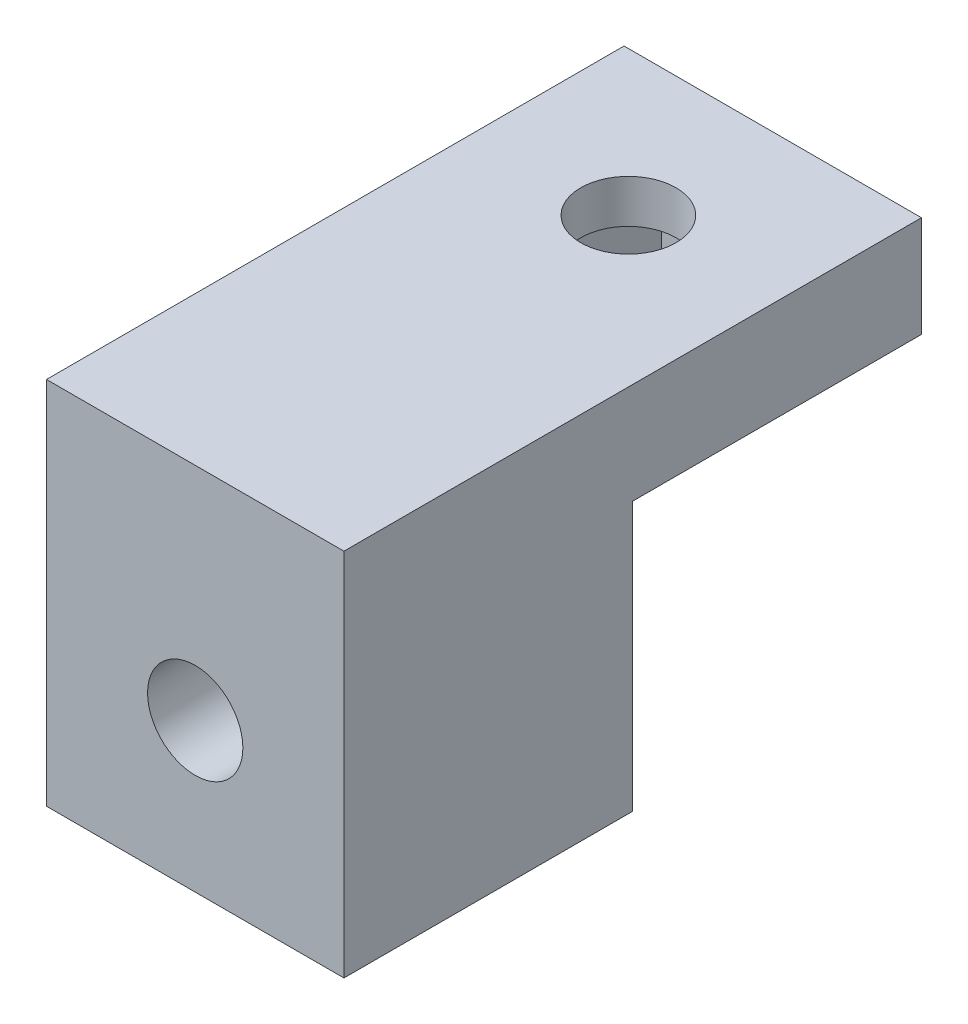
ISO-10303-21;
HEADER;
FILE_DESCRIPTION(('STEP AP214'),'2;1');
FILE_NAME('part.step','',(''),(''),'','','');
FILE_SCHEMA(('AUTOMOTIVE_DESIGN { 1 0 10303 214 1 1 1 1 }'));
ENDSEC;
DATA;
#1=APPLICATION_CONTEXT('core data for automotive mechanical design processes');
#2=APPLICATION_PROTOCOL_DEFINITION('international standard','automotive_design',2000,#1);
#3=PRODUCT_CONTEXT('',#1,'mechanical');
#4=PRODUCT('Part','Part','',(#3));
#5=PRODUCT_RELATED_PRODUCT_CATEGORY('part','',(#4));
#6=PRODUCT_DEFINITION_FORMATION('','',#4);
#7=PRODUCT_DEFINITION_CONTEXT('part definition',#1,'design');
#8=PRODUCT_DEFINITION('design','',#6,#7);
#9=PRODUCT_DEFINITION_SHAPE('','',#8);
#10=(LENGTH_UNIT() NAMED_UNIT(*) SI_UNIT(.MILLI.,.METRE.));
#11=(NAMED_UNIT(*) PLANE_ANGLE_UNIT() SI_UNIT($,.RADIAN.));
#12=(NAMED_UNIT(*) SI_UNIT($,.STERADIAN.) SOLID_ANGLE_UNIT());
#13=UNCERTAINTY_MEASURE_WITH_UNIT(LENGTH_MEASURE(1.E-05),#10,'distance_accuracy_value','');
#14=(GEOMETRIC_REPRESENTATION_CONTEXT(3) GLOBAL_UNCERTAINTY_ASSIGNED_CONTEXT((#13)) GLOBAL_UNIT_ASSIGNED_CONTEXT((#10,
#11,#12)) REPRESENTATION_CONTEXT('',''));
#15=CARTESIAN_POINT('',(0.,0.,0.));
#16=DIRECTION('',(0.,0.,1.));
#17=DIRECTION('',(1.,0.,0.));
#18=AXIS2_PLACEMENT_3D('',#15,#16,#17);
#19=CARTESIAN_POINT('',(0.,0.,-5.));
#20=DIRECTION('',(0.,0.,1.));
#21=DIRECTION('',(1.,0.,0.));
#22=AXIS2_PLACEMENT_3D('',#19,#20,#21);
#23=PLANE('',#22);
#24=DIRECTION('',(-1.,0.,0.));
#25=VECTOR('',#24,1.);
#26=CARTESIAN_POINT('',(1.65,-2.8,-5.));
#27=LINE('',#26,#25);
#28=CARTESIAN_POINT('',(1.65,-2.8,-5.));
#29=VERTEX_POINT('',#28);
#30=CARTESIAN_POINT('',(-1.65,-2.8,-5.));
#31=VERTEX_POINT('',#30);
#32=EDGE_CURVE('E275',#29,#31,#27,.T.);
#33=ORIENTED_EDGE('',*,*,#32,.F.);
#34=DIRECTION('',(-0.529219672623424,-0.848484848484849,0.));
#35=VECTOR('',#34,1.);
#36=CARTESIAN_POINT('',(3.3964249196573,0.,-5.));
#37=LINE('',#36,#35);
#38=CARTESIAN_POINT('',(3.3964249196573,0.,-5.));
#39=VERTEX_POINT('',#38);
#40=EDGE_CURVE('E255',#39,#29,#37,.T.);
#41=ORIENTED_EDGE('',*,*,#40,.F.);
#42=DIRECTION('',(0.529219672623423,-0.848484848484849,0.));
#43=VECTOR('',#42,1.);
#44=CARTESIAN_POINT('',(1.65,2.80000000000001,-5.));
#45=LINE('',#44,#43);
#46=CARTESIAN_POINT('',(1.65,2.80000000000001,-5.));
#47=VERTEX_POINT('',#46);
#48=EDGE_CURVE('E260',#47,#39,#45,.T.);
#49=ORIENTED_EDGE('',*,*,#48,.F.);
#50=DIRECTION('',(-1.,0.,0.));
#51=VECTOR('',#50,1.);
#52=CARTESIAN_POINT('',(1.65,2.80000000000001,-5.));
#53=LINE('',#52,#51);
#54=CARTESIAN_POINT('',(-1.65,2.80000000000001,-5.));
#55=VERTEX_POINT('',#54);
#56=EDGE_CURVE('E284',#47,#55,#53,.T.);
#57=ORIENTED_EDGE('',*,*,#56,.T.);
#58=DIRECTION('',(0.529219672623426,0.848484848484847,0.));
#59=VECTOR('',#58,1.);
#60=CARTESIAN_POINT('',(-3.39642491965731,0.,-5.));
#61=LINE('',#60,#59);
#62=CARTESIAN_POINT('',(-3.39642491965731,0.,-5.));
#63=VERTEX_POINT('',#62);
#64=EDGE_CURVE('E281',#63,#55,#61,.T.);
#65=ORIENTED_EDGE('',*,*,#64,.F.);
#66=DIRECTION('',(0.529219672623427,-0.848484848484847,0.));
#67=VECTOR('',#66,1.);
#68=CARTESIAN_POINT('',(-3.39642491965731,0.,-5.));
#69=LINE('',#68,#67);
#70=EDGE_CURVE('E278',#63,#31,#69,.T.);
#71=ORIENTED_EDGE('',*,*,#70,.T.);
#72=EDGE_LOOP('',(#33,#41,#49,#57,#65,#71));
#73=FACE_BOUND('',#72,.T.);
#74=DIRECTION('',(-1.,0.,0.));
#75=VECTOR('',#74,1.);
#76=CARTESIAN_POINT('',(5.15,4.15,-5.));
#77=LINE('',#76,#75);
#78=CARTESIAN_POINT('',(5.15,4.15,-5.));
#79=VERTEX_POINT('',#78);
#80=CARTESIAN_POINT('',(-5.15,4.15,-5.));
#81=VERTEX_POINT('',#80);
#82=EDGE_CURVE('E78',#79,#81,#77,.T.);
#83=ORIENTED_EDGE('',*,*,#82,.F.);
#84=DIRECTION('',(0.,1.,0.));
#85=VECTOR('',#84,1.);
#86=CARTESIAN_POINT('',(5.15,7.65,-5.));
#87=LINE('',#86,#85);
#88=CARTESIAN_POINT('',(5.15,-5.15,-5.));
#89=VERTEX_POINT('',#88);
#90=EDGE_CURVE('E304',#89,#79,#87,.T.);
#91=ORIENTED_EDGE('',*,*,#90,.F.);
#92=DIRECTION('',(1.,0.,0.));
#93=VECTOR('',#92,1.);
#94=CARTESIAN_POINT('',(-5.15,-5.15,-5.));
#95=LINE('',#94,#93);
#96=CARTESIAN_POINT('',(-5.15,-5.15,-5.));
#97=VERTEX_POINT('',#96);
#98=EDGE_CURVE('E309',#97,#89,#95,.T.);
#99=ORIENTED_EDGE('',*,*,#98,.F.);
#100=DIRECTION('',(0.,-1.,0.));
#101=VECTOR('',#100,1.);
#102=CARTESIAN_POINT('',(-5.15,7.65,-5.));
#103=LINE('',#102,#101);
#104=EDGE_CURVE('E317',#81,#97,#103,.T.);
#105=ORIENTED_EDGE('',*,*,#104,.F.);
#106=EDGE_LOOP('',(#83,#91,#99,#105));
#107=FACE_BOUND('',#106,.T.);
#108=ADVANCED_FACE('F55',(#73,#107),#23,.F.);
#109=CARTESIAN_POINT('',(0.,0.,5.));
#110=DIRECTION('',(0.,0.,1.));
#111=DIRECTION('',(1.,0.,0.));
#112=AXIS2_PLACEMENT_3D('',#109,#110,#111);
#113=PLANE('',#112);
#114=DIRECTION('',(0.,1.,0.));
#115=VECTOR('',#114,1.);
#116=CARTESIAN_POINT('',(5.15,7.65,5.));
#117=LINE('',#116,#115);
#118=CARTESIAN_POINT('',(5.15,-5.15,5.));
#119=VERTEX_POINT('',#118);
#120=CARTESIAN_POINT('',(5.15,7.65,5.));
#121=VERTEX_POINT('',#120);
#122=EDGE_CURVE('E305',#119,#121,#117,.T.);
#123=ORIENTED_EDGE('',*,*,#122,.T.);
#124=DIRECTION('',(-1.,0.,0.));
#125=VECTOR('',#124,1.);
#126=CARTESIAN_POINT('',(-5.15,7.65,5.));
#127=LINE('',#126,#125);
#128=CARTESIAN_POINT('',(-5.15,7.65,5.));
#129=VERTEX_POINT('',#128);
#130=EDGE_CURVE('E308',#121,#129,#127,.T.);
#131=ORIENTED_EDGE('',*,*,#130,.T.);
#132=DIRECTION('',(0.,-1.,0.));
#133=VECTOR('',#132,1.);
#134=CARTESIAN_POINT('',(-5.15,7.65,5.));
#135=LINE('',#134,#133);
#136=CARTESIAN_POINT('',(-5.15,-5.15,5.));
#137=VERTEX_POINT('',#136);
#138=EDGE_CURVE('E311',#129,#137,#135,.T.);
#139=ORIENTED_EDGE('',*,*,#138,.T.);
#140=DIRECTION('',(1.,0.,0.));
#141=VECTOR('',#140,1.);
#142=CARTESIAN_POINT('',(-5.15,-5.15,5.));
#143=LINE('',#142,#141);
#144=EDGE_CURVE('E313',#137,#119,#143,.T.);
#145=ORIENTED_EDGE('',*,*,#144,.T.);
#146=EDGE_LOOP('',(#123,#131,#139,#145));
#147=FACE_BOUND('',#146,.T.);
#148=CARTESIAN_POINT('',(0.,0.,5.));
#149=DIRECTION('',(0.,0.,1.));
#150=DIRECTION('',(1.,0.,0.));
#151=AXIS2_PLACEMENT_3D('',#148,#149,#150);
#152=CIRCLE('',#151,1.65);
#153=CARTESIAN_POINT('',(1.65,0.,5.));
#154=VERTEX_POINT('',#153);
#155=EDGE_CURVE('E291',#154,#154,#152,.T.);
#156=ORIENTED_EDGE('',*,*,#155,.F.);
#157=EDGE_LOOP('',(#156));
#158=FACE_BOUND('',#157,.T.);
#159=ADVANCED_FACE('F350',(#147,#158),#113,.T.);
#160=CARTESIAN_POINT('',(5.15,7.65,5.));
#161=DIRECTION('',(-1.,0.,0.));
#162=DIRECTION('',(0.,-1.,0.));
#163=AXIS2_PLACEMENT_3D('',#160,#161,#162);
#164=PLANE('',#163);
#165=ORIENTED_EDGE('',*,*,#90,.T.);
#166=DIRECTION('',(0.,0.,1.));
#167=VECTOR('',#166,1.);
#168=CARTESIAN_POINT('',(5.15,4.15,-15.));
#169=LINE('',#168,#167);
#170=CARTESIAN_POINT('',(5.15,4.15,-15.));
#171=VERTEX_POINT('',#170);
#172=EDGE_CURVE('E249',#171,#79,#169,.T.);
#173=ORIENTED_EDGE('',*,*,#172,.F.);
#174=DIRECTION('',(0.,-1.,0.));
#175=VECTOR('',#174,1.);
#176=CARTESIAN_POINT('',(5.15,7.65,-15.));
#177=LINE('',#176,#175);
#178=CARTESIAN_POINT('',(5.15,7.65,-15.));
#179=VERTEX_POINT('',#178);
#180=EDGE_CURVE('E238',#179,#171,#177,.T.);
#181=ORIENTED_EDGE('',*,*,#180,.F.);
#182=DIRECTION('',(0.,0.,-1.));
#183=VECTOR('',#182,1.);
#184=CARTESIAN_POINT('',(5.15,7.65,5.));
#185=LINE('',#184,#183);
#186=EDGE_CURVE('E12',#121,#179,#185,.T.);
#187=ORIENTED_EDGE('',*,*,#186,.F.);
#188=ORIENTED_EDGE('',*,*,#122,.F.);
#189=DIRECTION('',(0.,0.,-1.));
#190=VECTOR('',#189,1.);
#191=CARTESIAN_POINT('',(5.15,-5.15,5.));
#192=LINE('',#191,#190);
#193=EDGE_CURVE('E315',#119,#89,#192,.T.);
#194=ORIENTED_EDGE('',*,*,#193,.T.);
#195=EDGE_LOOP('',(#165,#173,#181,#187,#188,#194));
#196=FACE_BOUND('',#195,.T.);
#197=ADVANCED_FACE('F57',(#196),#164,.F.);
#198=CARTESIAN_POINT('',(-5.15,7.65,5.));
#199=DIRECTION('',(0.,-1.,0.));
#200=DIRECTION('',(0.,0.,-1.));
#201=AXIS2_PLACEMENT_3D('',#198,#199,#200);
#202=PLANE('',#201);
#203=CARTESIAN_POINT('',(0.,7.65,-10.));
#204=DIRECTION('',(0.,-1.,0.));
#205=DIRECTION('',(0.,0.,-1.));
#206=AXIS2_PLACEMENT_3D('',#203,#204,#205);
#207=CIRCLE('',#206,1.65);
#208=CARTESIAN_POINT('',(0.,7.65,-11.65));
#209=VERTEX_POINT('',#208);
#210=EDGE_CURVE('E206',#209,#209,#207,.F.);
#211=ORIENTED_EDGE('',*,*,#210,.F.);
#212=EDGE_LOOP('',(#211));
#213=FACE_BOUND('',#212,.T.);
#214=ORIENTED_EDGE('',*,*,#186,.T.);
#215=DIRECTION('',(1.,0.,0.));
#216=VECTOR('',#215,1.);
#217=CARTESIAN_POINT('',(-5.15,7.65,-15.));
#218=LINE('',#217,#216);
#219=CARTESIAN_POINT('',(-5.15,7.65,-15.));
#220=VERTEX_POINT('',#219);
#221=EDGE_CURVE('E235',#220,#179,#218,.T.);
#222=ORIENTED_EDGE('',*,*,#221,.F.);
#223=DIRECTION('',(0.,0.,-1.));
#224=VECTOR('',#223,1.);
#225=CARTESIAN_POINT('',(-5.15,7.65,5.));
#226=LINE('',#225,#224);
#227=EDGE_CURVE('E63',#129,#220,#226,.T.);
#228=ORIENTED_EDGE('',*,*,#227,.F.);
#229=ORIENTED_EDGE('',*,*,#130,.F.);
#230=EDGE_LOOP('',(#214,#222,#228,#229));
#231=FACE_BOUND('',#230,.T.);
#232=ADVANCED_FACE('F336',(#213,#231),#202,.F.);
#233=CARTESIAN_POINT('',(-5.15,7.65,5.));
#234=DIRECTION('',(1.,0.,0.));
#235=DIRECTION('',(0.,1.,0.));
#236=AXIS2_PLACEMENT_3D('',#233,#234,#235);
#237=PLANE('',#236);
#238=ORIENTED_EDGE('',*,*,#227,.T.);
#239=DIRECTION('',(0.,1.,0.));
#240=VECTOR('',#239,1.);
#241=CARTESIAN_POINT('',(-5.15,4.15,-15.));
#242=LINE('',#241,#240);
#243=CARTESIAN_POINT('',(-5.15,4.15,-15.));
#244=VERTEX_POINT('',#243);
#245=EDGE_CURVE('E242',#244,#220,#242,.T.);
#246=ORIENTED_EDGE('',*,*,#245,.F.);
#247=DIRECTION('',(0.,0.,1.));
#248=VECTOR('',#247,1.);
#249=CARTESIAN_POINT('',(-5.15,4.15,-15.));
#250=LINE('',#249,#248);
#251=EDGE_CURVE('E245',#244,#81,#250,.T.);
#252=ORIENTED_EDGE('',*,*,#251,.T.);
#253=ORIENTED_EDGE('',*,*,#104,.T.);
#254=DIRECTION('',(0.,0.,-1.));
#255=VECTOR('',#254,1.);
#256=CARTESIAN_POINT('',(-5.15,-5.15,5.));
#257=LINE('',#256,#255);
#258=EDGE_CURVE('E322',#137,#97,#257,.T.);
#259=ORIENTED_EDGE('',*,*,#258,.F.);
#260=ORIENTED_EDGE('',*,*,#138,.F.);
#261=EDGE_LOOP('',(#238,#246,#252,#253,#259,#260));
#262=FACE_BOUND('',#261,.T.);
#263=ADVANCED_FACE('F328',(#262),#237,.F.);
#264=CARTESIAN_POINT('',(-5.15,-5.15,5.));
#265=DIRECTION('',(0.,1.,0.));
#266=DIRECTION('',(0.,0.,1.));
#267=AXIS2_PLACEMENT_3D('',#264,#265,#266);
#268=PLANE('',#267);
#269=ORIENTED_EDGE('',*,*,#98,.T.);
#270=ORIENTED_EDGE('',*,*,#193,.F.);
#271=ORIENTED_EDGE('',*,*,#144,.F.);
#272=ORIENTED_EDGE('',*,*,#258,.T.);
#273=EDGE_LOOP('',(#269,#270,#271,#272));
#274=FACE_BOUND('',#273,.T.);
#275=ADVANCED_FACE('F347',(#274),#268,.F.);
#276=CARTESIAN_POINT('',(0.,0.,5.));
#277=DIRECTION('',(0.,0.,-1.));
#278=DIRECTION('',(-1.,0.,0.));
#279=AXIS2_PLACEMENT_3D('',#276,#277,#278);
#280=CYLINDRICAL_SURFACE('',#279,1.65);
#281=CARTESIAN_POINT('',(0.,0.,-3.));
#282=DIRECTION('',(0.,0.,-1.));
#283=DIRECTION('',(-1.,0.,0.));
#284=AXIS2_PLACEMENT_3D('',#281,#282,#283);
#285=CIRCLE('',#284,1.65);
#286=CARTESIAN_POINT('',(-1.65,0.,-3.));
#287=VERTEX_POINT('',#286);
#288=EDGE_CURVE('E252',#287,#287,#285,.T.);
#289=ORIENTED_EDGE('',*,*,#288,.T.);
#290=EDGE_LOOP('',(#289));
#291=FACE_BOUND('',#290,.T.);
#292=ORIENTED_EDGE('',*,*,#155,.T.);
#293=EDGE_LOOP('',(#292));
#294=FACE_BOUND('',#293,.T.);
#295=ADVANCED_FACE('F363',(#291,#294),#280,.F.);
#296=CARTESIAN_POINT('',(3.3964249196573,0.,-3.));
#297=DIRECTION('',(0.848484848484849,-0.529219672623424,0.));
#298=DIRECTION('',(0.529219672623424,0.848484848484849,0.));
#299=AXIS2_PLACEMENT_3D('',#296,#297,#298);
#300=PLANE('',#299);
#301=ORIENTED_EDGE('',*,*,#40,.T.);
#302=DIRECTION('',(0.,0.,-1.));
#303=VECTOR('',#302,1.);
#304=CARTESIAN_POINT('',(1.65,-2.8,-3.));
#305=LINE('',#304,#303);
#306=CARTESIAN_POINT('',(1.65,-2.8,-3.));
#307=VERTEX_POINT('',#306);
#308=EDGE_CURVE('E273',#307,#29,#305,.T.);
#309=ORIENTED_EDGE('',*,*,#308,.F.);
#310=DIRECTION('',(-0.529219672623424,-0.848484848484849,0.));
#311=VECTOR('',#310,1.);
#312=CARTESIAN_POINT('',(3.3964249196573,0.,-3.));
#313=LINE('',#312,#311);
#314=CARTESIAN_POINT('',(3.3964249196573,0.,-3.));
#315=VERTEX_POINT('',#314);
#316=EDGE_CURVE('E256',#315,#307,#313,.T.);
#317=ORIENTED_EDGE('',*,*,#316,.F.);
#318=DIRECTION('',(0.,0.,-1.));
#319=VECTOR('',#318,1.);
#320=CARTESIAN_POINT('',(3.3964249196573,0.,-3.));
#321=LINE('',#320,#319);
#322=EDGE_CURVE('E289',#315,#39,#321,.T.);
#323=ORIENTED_EDGE('',*,*,#322,.T.);
#324=EDGE_LOOP('',(#301,#309,#317,#323));
#325=FACE_BOUND('',#324,.T.);
#326=ADVANCED_FACE('F420',(#325),#300,.F.);
#327=CARTESIAN_POINT('',(1.65,2.80000000000001,-3.));
#328=DIRECTION('',(0.848484848484849,0.529219672623423,0.));
#329=DIRECTION('',(-0.529219672623423,0.848484848484849,0.));
#330=AXIS2_PLACEMENT_3D('',#327,#328,#329);
#331=PLANE('',#330);
#332=ORIENTED_EDGE('',*,*,#48,.T.);
#333=ORIENTED_EDGE('',*,*,#322,.F.);
#334=DIRECTION('',(0.529219672623423,-0.848484848484849,0.));
#335=VECTOR('',#334,1.);
#336=CARTESIAN_POINT('',(1.65,2.80000000000001,-3.));
#337=LINE('',#336,#335);
#338=CARTESIAN_POINT('',(1.65,2.80000000000001,-3.));
#339=VERTEX_POINT('',#338);
#340=EDGE_CURVE('E270',#339,#315,#337,.T.);
#341=ORIENTED_EDGE('',*,*,#340,.F.);
#342=DIRECTION('',(0.,0.,-1.));
#343=VECTOR('',#342,1.);
#344=CARTESIAN_POINT('',(1.65,2.80000000000001,-3.));
#345=LINE('',#344,#343);
#346=EDGE_CURVE('E292',#339,#47,#345,.T.);
#347=ORIENTED_EDGE('',*,*,#346,.T.);
#348=EDGE_LOOP('',(#332,#333,#341,#347));
#349=FACE_BOUND('',#348,.T.);
#350=ADVANCED_FACE('F416',(#349),#331,.F.);
#351=CARTESIAN_POINT('',(1.65,2.80000000000001,-3.));
#352=DIRECTION('',(0.,-1.,0.));
#353=DIRECTION('',(0.,0.,-1.));
#354=AXIS2_PLACEMENT_3D('',#351,#352,#353);
#355=PLANE('',#354);
#356=ORIENTED_EDGE('',*,*,#56,.F.);
#357=ORIENTED_EDGE('',*,*,#346,.F.);
#358=DIRECTION('',(-1.,0.,0.));
#359=VECTOR('',#358,1.);
#360=CARTESIAN_POINT('',(1.65,2.80000000000001,-3.));
#361=LINE('',#360,#359);
#362=CARTESIAN_POINT('',(-1.65,2.80000000000001,-3.));
#363=VERTEX_POINT('',#362);
#364=EDGE_CURVE('E268',#339,#363,#361,.T.);
#365=ORIENTED_EDGE('',*,*,#364,.T.);
#366=DIRECTION('',(0.,0.,-1.));
#367=VECTOR('',#366,1.);
#368=CARTESIAN_POINT('',(-1.65,2.80000000000001,-3.));
#369=LINE('',#368,#367);
#370=EDGE_CURVE('E294',#363,#55,#369,.T.);
#371=ORIENTED_EDGE('',*,*,#370,.T.);
#372=EDGE_LOOP('',(#356,#357,#365,#371));
#373=FACE_BOUND('',#372,.T.);
#374=ADVANCED_FACE('F419',(#373),#355,.T.);
#375=CARTESIAN_POINT('',(-3.39642491965731,0.,-3.));
#376=DIRECTION('',(-0.848484848484847,0.529219672623426,0.));
#377=DIRECTION('',(-0.529219672623426,-0.848484848484847,0.));
#378=AXIS2_PLACEMENT_3D('',#375,#376,#377);
#379=PLANE('',#378);
#380=ORIENTED_EDGE('',*,*,#64,.T.);
#381=ORIENTED_EDGE('',*,*,#370,.F.);
#382=DIRECTION('',(0.529219672623426,0.848484848484847,0.));
#383=VECTOR('',#382,1.);
#384=CARTESIAN_POINT('',(-3.39642491965731,0.,-3.));
#385=LINE('',#384,#383);
#386=CARTESIAN_POINT('',(-3.39642491965731,0.,-3.));
#387=VERTEX_POINT('',#386);
#388=EDGE_CURVE('E265',#387,#363,#385,.T.);
#389=ORIENTED_EDGE('',*,*,#388,.F.);
#390=DIRECTION('',(0.,0.,-1.));
#391=VECTOR('',#390,1.);
#392=CARTESIAN_POINT('',(-3.39642491965731,0.,-3.));
#393=LINE('',#392,#391);
#394=EDGE_CURVE('E296',#387,#63,#393,.T.);
#395=ORIENTED_EDGE('',*,*,#394,.T.);
#396=EDGE_LOOP('',(#380,#381,#389,#395));
#397=FACE_BOUND('',#396,.T.);
#398=ADVANCED_FACE('F424',(#397),#379,.F.);
#399=CARTESIAN_POINT('',(-3.39642491965731,0.,-3.));
#400=DIRECTION('',(0.848484848484847,0.529219672623427,0.));
#401=DIRECTION('',(-0.529219672623427,0.848484848484847,0.));
#402=AXIS2_PLACEMENT_3D('',#399,#400,#401);
#403=PLANE('',#402);
#404=ORIENTED_EDGE('',*,*,#70,.F.);
#405=ORIENTED_EDGE('',*,*,#394,.F.);
#406=DIRECTION('',(0.529219672623427,-0.848484848484847,0.));
#407=VECTOR('',#406,1.);
#408=CARTESIAN_POINT('',(-3.39642491965731,0.,-3.));
#409=LINE('',#408,#407);
#410=CARTESIAN_POINT('',(-1.65,-2.8,-3.));
#411=VERTEX_POINT('',#410);
#412=EDGE_CURVE('E263',#387,#411,#409,.T.);
#413=ORIENTED_EDGE('',*,*,#412,.T.);
#414=DIRECTION('',(0.,0.,-1.));
#415=VECTOR('',#414,1.);
#416=CARTESIAN_POINT('',(-1.65,-2.8,-3.));
#417=LINE('',#416,#415);
#418=EDGE_CURVE('E298',#411,#31,#417,.T.);
#419=ORIENTED_EDGE('',*,*,#418,.T.);
#420=EDGE_LOOP('',(#404,#405,#413,#419));
#421=FACE_BOUND('',#420,.T.);
#422=ADVANCED_FACE('F428',(#421),#403,.T.);
#423=CARTESIAN_POINT('',(1.65,-2.8,-3.));
#424=DIRECTION('',(0.,-1.,0.));
#425=DIRECTION('',(0.,0.,-1.));
#426=AXIS2_PLACEMENT_3D('',#423,#424,#425);
#427=PLANE('',#426);
#428=ORIENTED_EDGE('',*,*,#32,.T.);
#429=ORIENTED_EDGE('',*,*,#418,.F.);
#430=DIRECTION('',(-1.,0.,0.));
#431=VECTOR('',#430,1.);
#432=CARTESIAN_POINT('',(1.65,-2.8,-3.));
#433=LINE('',#432,#431);
#434=EDGE_CURVE('E259',#307,#411,#433,.T.);
#435=ORIENTED_EDGE('',*,*,#434,.F.);
#436=ORIENTED_EDGE('',*,*,#308,.T.);
#437=EDGE_LOOP('',(#428,#429,#435,#436));
#438=FACE_BOUND('',#437,.T.);
#439=ADVANCED_FACE('F414',(#438),#427,.F.);
#440=CARTESIAN_POINT('',(0.,0.,-3.));
#441=DIRECTION('',(0.,0.,1.));
#442=DIRECTION('',(1.,0.,0.));
#443=AXIS2_PLACEMENT_3D('',#440,#441,#442);
#444=PLANE('',#443);
#445=ORIENTED_EDGE('',*,*,#288,.F.);
#446=EDGE_LOOP('',(#445));
#447=FACE_BOUND('',#446,.T.);
#448=ORIENTED_EDGE('',*,*,#316,.T.);
#449=ORIENTED_EDGE('',*,*,#434,.T.);
#450=ORIENTED_EDGE('',*,*,#412,.F.);
#451=ORIENTED_EDGE('',*,*,#388,.T.);
#452=ORIENTED_EDGE('',*,*,#364,.F.);
#453=ORIENTED_EDGE('',*,*,#340,.T.);
#454=EDGE_LOOP('',(#448,#449,#450,#451,#452,#453));
#455=FACE_BOUND('',#454,.T.);
#456=ADVANCED_FACE('F410',(#447,#455),#444,.F.);
#457=CARTESIAN_POINT('',(5.15,4.15,-15.));
#458=DIRECTION('',(0.,1.,0.));
#459=DIRECTION('',(0.,0.,1.));
#460=AXIS2_PLACEMENT_3D('',#457,#458,#459);
#461=PLANE('',#460);
#462=DIRECTION('',(0.529219672623424,0.,-0.848484848484849));
#463=VECTOR('',#462,1.);
#464=CARTESIAN_POINT('',(-6.9355251717647,4.15,-4.32584785388583));
#465=LINE('',#464,#463);
#466=CARTESIAN_POINT('',(-3.3964249196573,4.15,-10.));
#467=VERTEX_POINT('',#466);
#468=CARTESIAN_POINT('',(-1.65,4.15,-12.8));
#469=VERTEX_POINT('',#468);
#470=EDGE_CURVE('E216',#467,#469,#465,.T.);
#471=ORIENTED_EDGE('',*,*,#470,.F.);
#472=DIRECTION('',(-0.529219672623423,0.,-0.848484848484849));
#473=VECTOR('',#472,1.);
#474=CARTESIAN_POINT('',(2.04517230305703,4.15,-1.27562138394703));
#475=LINE('',#474,#473);
#476=CARTESIAN_POINT('',(-1.65,4.15,-7.19999999999999));
#477=VERTEX_POINT('',#476);
#478=EDGE_CURVE('E70',#477,#467,#475,.T.);
#479=ORIENTED_EDGE('',*,*,#478,.F.);
#480=DIRECTION('',(1.,0.,0.));
#481=VECTOR('',#480,1.);
#482=CARTESIAN_POINT('',(0.,4.15,-7.19999999999999));
#483=LINE('',#482,#481);
#484=CARTESIAN_POINT('',(1.65,4.15,-7.19999999999999));
#485=VERTEX_POINT('',#484);
#486=EDGE_CURVE('E200',#477,#485,#483,.T.);
#487=ORIENTED_EDGE('',*,*,#486,.T.);
#488=DIRECTION('',(-0.529219672623426,0.,0.848484848484847));
#489=VECTOR('',#488,1.);
#490=CARTESIAN_POINT('',(-2.04517230305705,4.15,-1.27562138394705));
#491=LINE('',#490,#489);
#492=CARTESIAN_POINT('',(3.39642491965731,4.15,-10.));
#493=VERTEX_POINT('',#492);
#494=EDGE_CURVE('E203',#493,#485,#491,.T.);
#495=ORIENTED_EDGE('',*,*,#494,.F.);
#496=DIRECTION('',(-0.529219672623427,0.,-0.848484848484847));
#497=VECTOR('',#496,1.);
#498=CARTESIAN_POINT('',(6.93552517176471,4.15,-4.32584785388587));
#499=LINE('',#498,#497);
#500=CARTESIAN_POINT('',(1.65,4.15,-12.8));
#501=VERTEX_POINT('',#500);
#502=EDGE_CURVE('E221',#493,#501,#499,.T.);
#503=ORIENTED_EDGE('',*,*,#502,.T.);
#504=DIRECTION('',(1.,0.,0.));
#505=VECTOR('',#504,1.);
#506=CARTESIAN_POINT('',(0.,4.15,-12.8));
#507=LINE('',#506,#505);
#508=EDGE_CURVE('E218',#469,#501,#507,.T.);
#509=ORIENTED_EDGE('',*,*,#508,.F.);
#510=EDGE_LOOP('',(#471,#479,#487,#495,#503,#509));
#511=FACE_BOUND('',#510,.T.);
#512=ORIENTED_EDGE('',*,*,#82,.T.);
#513=ORIENTED_EDGE('',*,*,#251,.F.);
#514=DIRECTION('',(-1.,0.,0.));
#515=VECTOR('',#514,1.);
#516=CARTESIAN_POINT('',(5.15,4.15,-15.));
#517=LINE('',#516,#515);
#518=EDGE_CURVE('E240',#171,#244,#517,.T.);
#519=ORIENTED_EDGE('',*,*,#518,.F.);
#520=ORIENTED_EDGE('',*,*,#172,.T.);
#521=EDGE_LOOP('',(#512,#513,#519,#520));
#522=FACE_BOUND('',#521,.T.);
#523=ADVANCED_FACE('F343',(#511,#522),#461,.F.);
#524=CARTESIAN_POINT('',(0.,0.,-15.));
#525=DIRECTION('',(0.,0.,-1.));
#526=DIRECTION('',(-1.,0.,0.));
#527=AXIS2_PLACEMENT_3D('',#524,#525,#526);
#528=PLANE('',#527);
#529=ORIENTED_EDGE('',*,*,#221,.T.);
#530=ORIENTED_EDGE('',*,*,#180,.T.);
#531=ORIENTED_EDGE('',*,*,#518,.T.);
#532=ORIENTED_EDGE('',*,*,#245,.T.);
#533=EDGE_LOOP('',(#529,#530,#531,#532));
#534=FACE_BOUND('',#533,.T.);
#535=ADVANCED_FACE('F333',(#534),#528,.T.);
#536=CARTESIAN_POINT('',(2.04517230305703,6.15,-1.27562138394703));
#537=DIRECTION('',(-0.848484848484849,0.,0.529219672623423));
#538=DIRECTION('',(0.529219672623423,0.,0.848484848484849));
#539=AXIS2_PLACEMENT_3D('',#536,#537,#538);
#540=PLANE('',#539);
#541=ORIENTED_EDGE('',*,*,#478,.T.);
#542=DIRECTION('',(0.,-1.,0.));
#543=VECTOR('',#542,1.);
#544=CARTESIAN_POINT('',(-3.3964249196573,6.15,-10.));
#545=LINE('',#544,#543);
#546=CARTESIAN_POINT('',(-3.3964249196573,6.15,-10.));
#547=VERTEX_POINT('',#546);
#548=EDGE_CURVE('E178',#547,#467,#545,.T.);
#549=ORIENTED_EDGE('',*,*,#548,.F.);
#550=DIRECTION('',(-0.529219672623423,0.,-0.848484848484849));
#551=VECTOR('',#550,1.);
#552=CARTESIAN_POINT('',(2.04517230305703,6.15,-1.27562138394703));
#553=LINE('',#552,#551);
#554=CARTESIAN_POINT('',(-1.65,6.15,-7.19999999999999));
#555=VERTEX_POINT('',#554);
#556=EDGE_CURVE('E182',#555,#547,#553,.T.);
#557=ORIENTED_EDGE('',*,*,#556,.F.);
#558=DIRECTION('',(0.,-1.,0.));
#559=VECTOR('',#558,1.);
#560=CARTESIAN_POINT('',(-1.65,6.15,-7.19999999999999));
#561=LINE('',#560,#559);
#562=EDGE_CURVE('E226',#555,#477,#561,.T.);
#563=ORIENTED_EDGE('',*,*,#562,.T.);
#564=EDGE_LOOP('',(#541,#549,#557,#563));
#565=FACE_BOUND('',#564,.T.);
#566=ADVANCED_FACE('F180',(#565),#540,.F.);
#567=CARTESIAN_POINT('',(0.,6.15,-7.19999999999999));
#568=DIRECTION('',(0.,0.,-1.));
#569=DIRECTION('',(-1.,0.,0.));
#570=AXIS2_PLACEMENT_3D('',#567,#568,#569);
#571=PLANE('',#570);
#572=ORIENTED_EDGE('',*,*,#486,.F.);
#573=ORIENTED_EDGE('',*,*,#562,.F.);
#574=DIRECTION('',(1.,0.,0.));
#575=VECTOR('',#574,1.);
#576=CARTESIAN_POINT('',(0.,6.15,-7.19999999999999));
#577=LINE('',#576,#575);
#578=CARTESIAN_POINT('',(1.65,6.15,-7.19999999999999));
#579=VERTEX_POINT('',#578);
#580=EDGE_CURVE('E187',#555,#579,#577,.T.);
#581=ORIENTED_EDGE('',*,*,#580,.T.);
#582=DIRECTION('',(0.,-1.,0.));
#583=VECTOR('',#582,1.);
#584=CARTESIAN_POINT('',(1.65,6.15,-7.19999999999999));
#585=LINE('',#584,#583);
#586=EDGE_CURVE('E228',#579,#485,#585,.T.);
#587=ORIENTED_EDGE('',*,*,#586,.T.);
#588=EDGE_LOOP('',(#572,#573,#581,#587));
#589=FACE_BOUND('',#588,.T.);
#590=ADVANCED_FACE('F389',(#589),#571,.T.);
#591=CARTESIAN_POINT('',(-2.04517230305705,6.15,-1.27562138394705));
#592=DIRECTION('',(0.848484848484847,0.,0.529219672623426));
#593=DIRECTION('',(0.529219672623426,0.,-0.848484848484847));
#594=AXIS2_PLACEMENT_3D('',#591,#592,#593);
#595=PLANE('',#594);
#596=ORIENTED_EDGE('',*,*,#494,.T.);
#597=ORIENTED_EDGE('',*,*,#586,.F.);
#598=DIRECTION('',(-0.529219672623426,0.,0.848484848484847));
#599=VECTOR('',#598,1.);
#600=CARTESIAN_POINT('',(-2.04517230305705,6.15,-1.27562138394705));
#601=LINE('',#600,#599);
#602=CARTESIAN_POINT('',(3.39642491965731,6.15,-10.));
#603=VERTEX_POINT('',#602);
#604=EDGE_CURVE('E212',#603,#579,#601,.T.);
#605=ORIENTED_EDGE('',*,*,#604,.F.);
#606=DIRECTION('',(0.,-1.,0.));
#607=VECTOR('',#606,1.);
#608=CARTESIAN_POINT('',(3.39642491965731,6.15,-10.));
#609=LINE('',#608,#607);
#610=EDGE_CURVE('E230',#603,#493,#609,.T.);
#611=ORIENTED_EDGE('',*,*,#610,.T.);
#612=EDGE_LOOP('',(#596,#597,#605,#611));
#613=FACE_BOUND('',#612,.T.);
#614=ADVANCED_FACE('F392',(#613),#595,.F.);
#615=CARTESIAN_POINT('',(6.93552517176471,6.15,-4.32584785388587));
#616=DIRECTION('',(-0.848484848484847,0.,0.529219672623427));
#617=DIRECTION('',(0.529219672623427,0.,0.848484848484847));
#618=AXIS2_PLACEMENT_3D('',#615,#616,#617);
#619=PLANE('',#618);
#620=ORIENTED_EDGE('',*,*,#502,.F.);
#621=ORIENTED_EDGE('',*,*,#610,.F.);
#622=DIRECTION('',(-0.529219672623427,0.,-0.848484848484847));
#623=VECTOR('',#622,1.);
#624=CARTESIAN_POINT('',(6.93552517176471,6.15,-4.32584785388587));
#625=LINE('',#624,#623);
#626=CARTESIAN_POINT('',(1.65,6.15,-12.8));
#627=VERTEX_POINT('',#626);
#628=EDGE_CURVE('E210',#603,#627,#625,.T.);
#629=ORIENTED_EDGE('',*,*,#628,.T.);
#630=DIRECTION('',(0.,-1.,0.));
#631=VECTOR('',#630,1.);
#632=CARTESIAN_POINT('',(1.65,6.15,-12.8));
#633=LINE('',#632,#631);
#634=EDGE_CURVE('E232',#627,#501,#633,.T.);
#635=ORIENTED_EDGE('',*,*,#634,.T.);
#636=EDGE_LOOP('',(#620,#621,#629,#635));
#637=FACE_BOUND('',#636,.T.);
#638=ADVANCED_FACE('F396',(#637),#619,.T.);
#639=CARTESIAN_POINT('',(0.,6.15,-12.8));
#640=DIRECTION('',(0.,0.,-1.));
#641=DIRECTION('',(-1.,0.,0.));
#642=AXIS2_PLACEMENT_3D('',#639,#640,#641);
#643=PLANE('',#642);
#644=ORIENTED_EDGE('',*,*,#508,.T.);
#645=ORIENTED_EDGE('',*,*,#634,.F.);
#646=DIRECTION('',(1.,0.,0.));
#647=VECTOR('',#646,1.);
#648=CARTESIAN_POINT('',(0.,6.15,-12.8));
#649=LINE('',#648,#647);
#650=CARTESIAN_POINT('',(-1.65,6.15,-12.8));
#651=VERTEX_POINT('',#650);
#652=EDGE_CURVE('E195',#651,#627,#649,.T.);
#653=ORIENTED_EDGE('',*,*,#652,.F.);
#654=DIRECTION('',(0.,-1.,0.));
#655=VECTOR('',#654,1.);
#656=CARTESIAN_POINT('',(-1.65,6.15,-12.8));
#657=LINE('',#656,#655);
#658=EDGE_CURVE('E186',#651,#469,#657,.T.);
#659=ORIENTED_EDGE('',*,*,#658,.T.);
#660=EDGE_LOOP('',(#644,#645,#653,#659));
#661=FACE_BOUND('',#660,.T.);
#662=ADVANCED_FACE('F386',(#661),#643,.F.);
#663=CARTESIAN_POINT('',(-6.9355251717647,6.15,-4.32584785388583));
#664=DIRECTION('',(-0.848484848484849,0.,-0.529219672623424));
#665=DIRECTION('',(-0.529219672623424,0.,0.848484848484849));
#666=AXIS2_PLACEMENT_3D('',#663,#664,#665);
#667=PLANE('',#666);
#668=ORIENTED_EDGE('',*,*,#470,.T.);
#669=ORIENTED_EDGE('',*,*,#658,.F.);
#670=DIRECTION('',(0.529219672623424,0.,-0.848484848484849));
#671=VECTOR('',#670,1.);
#672=CARTESIAN_POINT('',(-6.9355251717647,6.15,-4.32584785388583));
#673=LINE('',#672,#671);
#674=EDGE_CURVE('E190',#547,#651,#673,.T.);
#675=ORIENTED_EDGE('',*,*,#674,.F.);
#676=ORIENTED_EDGE('',*,*,#548,.T.);
#677=EDGE_LOOP('',(#668,#669,#675,#676));
#678=FACE_BOUND('',#677,.T.);
#679=ADVANCED_FACE('F191',(#678),#667,.F.);
#680=CARTESIAN_POINT('',(0.,6.15,0.));
#681=DIRECTION('',(0.,-1.,0.));
#682=DIRECTION('',(0.,0.,-1.));
#683=AXIS2_PLACEMENT_3D('',#680,#681,#682);
#684=PLANE('',#683);
#685=CARTESIAN_POINT('',(0.,6.15,-10.));
#686=DIRECTION('',(0.,-1.,0.));
#687=DIRECTION('',(0.,0.,-1.));
#688=AXIS2_PLACEMENT_3D('',#685,#686,#687);
#689=CIRCLE('',#688,1.65);
#690=CARTESIAN_POINT('',(0.,6.15,-11.65));
#691=VERTEX_POINT('',#690);
#692=EDGE_CURVE('E373',#691,#691,#689,.T.);
#693=ORIENTED_EDGE('',*,*,#692,.F.);
#694=EDGE_LOOP('',(#693));
#695=FACE_BOUND('',#694,.T.);
#696=ORIENTED_EDGE('',*,*,#556,.T.);
#697=ORIENTED_EDGE('',*,*,#674,.T.);
#698=ORIENTED_EDGE('',*,*,#652,.T.);
#699=ORIENTED_EDGE('',*,*,#628,.F.);
#700=ORIENTED_EDGE('',*,*,#604,.T.);
#701=ORIENTED_EDGE('',*,*,#580,.F.);
#702=EDGE_LOOP('',(#696,#697,#698,#699,#700,#701));
#703=FACE_BOUND('',#702,.T.);
#704=ADVANCED_FACE('F198',(#695,#703),#684,.T.);
#705=CARTESIAN_POINT('',(0.,12.3169047558312,-10.));
#706=DIRECTION('',(0.,-1.,0.));
#707=DIRECTION('',(0.,0.,-1.));
#708=AXIS2_PLACEMENT_3D('',#705,#706,#707);
#709=CYLINDRICAL_SURFACE('',#708,1.65);
#710=ORIENTED_EDGE('',*,*,#210,.T.);
#711=EDGE_LOOP('',(#710));
#712=FACE_BOUND('',#711,.T.);
#713=ORIENTED_EDGE('',*,*,#692,.T.);
#714=EDGE_LOOP('',(#713));
#715=FACE_BOUND('',#714,.T.);
#716=ADVANCED_FACE('F377',(#712,#715),#709,.F.);
#717=CLOSED_SHELL('',(#108,#159,#197,#232,#263,#275,#295,#326,#350,#374,#398,#422,#439,#456,
#523,#535,#566,#590,#614,#638,#662,#679,#704,#716));
#718=MANIFOLD_SOLID_BREP('B2',#717);
#719=ADVANCED_BREP_SHAPE_REPRESENTATION('',(#18,#718),#14);
#720=SHAPE_DEFINITION_REPRESENTATION(#9,#719);
ENDSEC;
END-ISO-10303-21;
